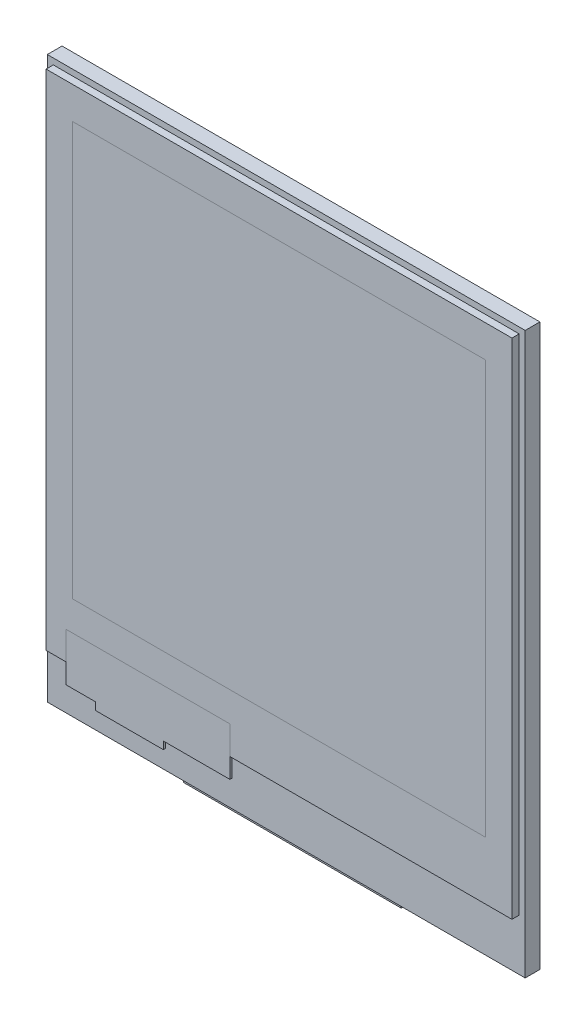
ISO-10303-21;
HEADER;
FILE_DESCRIPTION(('STEP AP214'),'2;1');
FILE_NAME('part.step','',(''),(''),'','','');
FILE_SCHEMA(('AUTOMOTIVE_DESIGN { 1 0 10303 214 1 1 1 1 }'));
ENDSEC;
DATA;
#1=APPLICATION_CONTEXT('core data for automotive mechanical design processes');
#2=APPLICATION_PROTOCOL_DEFINITION('international standard','automotive_design',2000,#1);
#3=PRODUCT_CONTEXT('',#1,'mechanical');
#4=PRODUCT('Part','Part','',(#3));
#5=PRODUCT_RELATED_PRODUCT_CATEGORY('part','',(#4));
#6=PRODUCT_DEFINITION_FORMATION('','',#4);
#7=PRODUCT_DEFINITION_CONTEXT('part definition',#1,'design');
#8=PRODUCT_DEFINITION('design','',#6,#7);
#9=PRODUCT_DEFINITION_SHAPE('','',#8);
#10=(LENGTH_UNIT() NAMED_UNIT(*) SI_UNIT(.MILLI.,.METRE.));
#11=(NAMED_UNIT(*) PLANE_ANGLE_UNIT() SI_UNIT($,.RADIAN.));
#12=(NAMED_UNIT(*) SI_UNIT($,.STERADIAN.) SOLID_ANGLE_UNIT());
#13=UNCERTAINTY_MEASURE_WITH_UNIT(LENGTH_MEASURE(1.E-05),#10,'distance_accuracy_value','');
#14=(GEOMETRIC_REPRESENTATION_CONTEXT(3) GLOBAL_UNCERTAINTY_ASSIGNED_CONTEXT((#13)) GLOBAL_UNIT_ASSIGNED_CONTEXT((#10,
#11,#12)) REPRESENTATION_CONTEXT('',''));
#15=CARTESIAN_POINT('',(0.,0.,0.));
#16=DIRECTION('',(0.,0.,1.));
#17=DIRECTION('',(1.,0.,0.));
#18=AXIS2_PLACEMENT_3D('',#15,#16,#17);
#19=CARTESIAN_POINT('',(0.,0.,1.46));
#20=DIRECTION('',(0.,0.,-1.));
#21=DIRECTION('',(-1.,0.,0.));
#22=AXIS2_PLACEMENT_3D('',#19,#20,#21);
#23=PLANE('',#22);
#24=CARTESIAN_POINT('',(-13.7549999999994,-11.3900000000022,1.46));
#25=CARTESIAN_POINT('',(-13.7549999999998,-11.062500000002,1.46));
#26=CARTESIAN_POINT('',(-13.7550000000005,-10.4075000000016,1.46));
#27=CARTESIAN_POINT('',(-13.7550000000015,-9.42500000000101,1.46));
#28=CARTESIAN_POINT('',(-13.7550000000024,-8.44250000000035,1.46));
#29=CARTESIAN_POINT('',(-13.7550000000029,-7.45999999999966,1.46));
#30=CARTESIAN_POINT('',(-13.7550000000033,-6.47749999999892,1.46));
#31=CARTESIAN_POINT('',(-13.7550000000035,-5.49499999999817,1.46));
#32=CARTESIAN_POINT('',(-13.7550000000034,-4.5124999999974,1.46));
#33=CARTESIAN_POINT('',(-13.7550000000032,-3.52999999999665,1.46));
#34=CARTESIAN_POINT('',(-13.7550000000027,-2.5474999999959,1.46));
#35=CARTESIAN_POINT('',(-13.755000000002,-1.56499999999521,1.46));
#36=CARTESIAN_POINT('',(-13.7550000000012,-0.582499999994542,1.46));
#37=CARTESIAN_POINT('',(-13.7550000000004,0.400000000006056,1.46));
#38=CARTESIAN_POINT('',(-13.7549999999993,1.38250000000663,1.46));
#39=CARTESIAN_POINT('',(-13.7549999999982,2.36500000000713,1.46));
#40=CARTESIAN_POINT('',(-13.7549999999973,3.3475000000076,1.46));
#41=CARTESIAN_POINT('',(-13.7549999999964,4.330000000008,1.46));
#42=CARTESIAN_POINT('',(-13.7549999999955,5.31250000000838,1.46));
#43=CARTESIAN_POINT('',(-13.7549999999946,6.29500000000871,1.46));
#44=CARTESIAN_POINT('',(-13.7549999999937,7.27750000000901,1.46));
#45=CARTESIAN_POINT('',(-13.7549999999929,8.26000000000927,1.46));
#46=CARTESIAN_POINT('',(-13.754999999992,9.24250000000949,1.46));
#47=CARTESIAN_POINT('',(-13.7549999999911,10.2250000000097,1.46));
#48=CARTESIAN_POINT('',(-13.7549999999902,11.2075000000099,1.46));
#49=CARTESIAN_POINT('',(-13.7549999999893,12.19000000001,1.46));
#50=CARTESIAN_POINT('',(-13.7549999999883,13.1725000000101,1.46));
#51=CARTESIAN_POINT('',(-13.7549999999873,14.1550000000102,1.46));
#52=CARTESIAN_POINT('',(-13.7549999999863,15.1375000000103,1.46));
#53=CARTESIAN_POINT('',(-13.7549999999856,15.7925000000103,1.46));
#54=CARTESIAN_POINT('',(-13.7549999999852,16.1200000000104,1.46));
#55=B_SPLINE_CURVE_WITH_KNOTS('',3,(#24,#25,#26,#27,#28,#29,#30,#31,#32,#33,#34,#35,#36,#37,#38,
#39,#40,#41,#42,#43,#44,#45,#46,#47,#48,#49,#50,#51,#52,#53,#54),.UNSPECIFIED.,.F.,.F.,(4,1,1,1,
1,1,1,1,1,1,1,1,1,1,1,1,1,1,1,1,1,1,1,1,1,1,1,1,4),(0.,0.0357142857142883,0.0714285714285811,
0.107142857142873,0.142857142857169,0.178571428571464,0.214285714285763,0.250000000000059,
0.285714285714357,0.321428571428653,0.357142857142949,0.392857142857241,0.428571428571534,
0.464285714285823,0.500000000000112,0.535714285714397,0.571428571428682,0.607142857142965,
0.642857142857247,0.678571428571526,0.714285714285806,0.750000000000083,0.78571428571436,
0.821428571428635,0.857142857142909,0.892857142857183,0.928571428571456,0.964285714285729,1.),.UNSPECIFIED.);
#56=CARTESIAN_POINT('',(-13.7549999999994,-11.3900000000022,1.46));
#57=VERTEX_POINT('',#56);
#58=CARTESIAN_POINT('',(-13.7549999999852,16.1200000000104,1.46));
#59=VERTEX_POINT('',#58);
#60=EDGE_CURVE('E865',#57,#59,#55,.T.);
#61=ORIENTED_EDGE('',*,*,#60,.T.);
#62=CARTESIAN_POINT('',(-13.7549999999852,16.1200000000104,1.46));
#63=CARTESIAN_POINT('',(-13.4274999999853,16.1200000000099,1.46));
#64=CARTESIAN_POINT('',(-12.7724999999854,16.1200000000091,1.46));
#65=CARTESIAN_POINT('',(-11.7899999999857,16.120000000008,1.46));
#66=CARTESIAN_POINT('',(-10.807499999986,16.1200000000069,1.46));
#67=CARTESIAN_POINT('',(-9.8249999999864,16.1200000000059,1.46));
#68=CARTESIAN_POINT('',(-8.84249999998682,16.1200000000049,1.46));
#69=CARTESIAN_POINT('',(-7.85999999998727,16.1200000000041,1.46));
#70=CARTESIAN_POINT('',(-6.87749999998775,16.1200000000032,1.46));
#71=CARTESIAN_POINT('',(-5.89499999998824,16.1200000000026,1.46));
#72=CARTESIAN_POINT('',(-4.91249999998874,16.1200000000019,1.46));
#73=CARTESIAN_POINT('',(-3.92999999998925,16.1200000000014,1.46));
#74=CARTESIAN_POINT('',(-2.94749999998975,16.1200000000009,1.46));
#75=CARTESIAN_POINT('',(-1.96499999999025,16.1200000000005,1.46));
#76=CARTESIAN_POINT('',(-0.982499999990737,16.1200000000001,1.46));
#77=CARTESIAN_POINT('',(8.7901976060676E-12,16.1199999999999,1.46));
#78=CARTESIAN_POINT('',(0.982500000008335,16.1199999999996,1.46));
#79=CARTESIAN_POINT('',(1.9650000000079,16.1199999999994,1.46));
#80=CARTESIAN_POINT('',(2.9475000000075,16.1199999999992,1.46));
#81=CARTESIAN_POINT('',(3.93000000000712,16.1199999999992,1.46));
#82=CARTESIAN_POINT('',(4.91250000000677,16.1199999999991,1.46));
#83=CARTESIAN_POINT('',(5.89500000000646,16.1199999999991,1.46));
#84=CARTESIAN_POINT('',(6.87750000000618,16.119999999999,1.46));
#85=CARTESIAN_POINT('',(7.86000000000593,16.119999999999,1.46));
#86=CARTESIAN_POINT('',(8.84250000000573,16.1199999999991,1.46));
#87=CARTESIAN_POINT('',(9.82500000000555,16.1199999999991,1.46));
#88=CARTESIAN_POINT('',(10.8075000000054,16.1199999999991,1.46));
#89=CARTESIAN_POINT('',(11.7900000000053,16.119999999999,1.46));
#90=CARTESIAN_POINT('',(12.7725000000053,16.119999999999,1.46));
#91=CARTESIAN_POINT('',(13.4275000000052,16.119999999999,1.46));
#92=CARTESIAN_POINT('',(13.7550000000052,16.1199999999989,1.46));
#93=B_SPLINE_CURVE_WITH_KNOTS('',3,(#62,#63,#64,#65,#66,#67,#68,#69,#70,#71,#72,#73,#74,#75,#76,
#77,#78,#79,#80,#81,#82,#83,#84,#85,#86,#87,#88,#89,#90,#91,#92),.UNSPECIFIED.,.F.,.F.,(4,1,1,1,
1,1,1,1,1,1,1,1,1,1,1,1,1,1,1,1,1,1,1,1,1,1,1,1,4),(0.,0.0357142857142905,0.0714285714285789,
0.107142857142865,0.14285714285715,0.178571428571432,0.214285714285714,0.249999999999995,
0.285714285714275,0.321428571428555,0.357142857142834,0.392857142857114,0.428571428571394,
0.464285714285675,0.499999999999956,0.535714285714237,0.57142857142852,0.607142857142803,
0.642857142857087,0.678571428571373,0.714285714285659,0.749999999999947,0.785714285714237,
0.821428571428527,0.857142857142819,0.892857142857112,0.928571428571407,0.964285714285703,1.),.UNSPECIFIED.);
#94=CARTESIAN_POINT('',(13.7550000000052,16.1199999999989,1.46));
#95=VERTEX_POINT('',#94);
#96=EDGE_CURVE('E886',#59,#95,#93,.T.);
#97=ORIENTED_EDGE('',*,*,#96,.T.);
#98=CARTESIAN_POINT('',(13.7550000000052,16.1199999999989,1.46));
#99=CARTESIAN_POINT('',(13.7550000000051,15.792499999999,1.46));
#100=CARTESIAN_POINT('',(13.755000000005,15.137499999999,1.46));
#101=CARTESIAN_POINT('',(13.7550000000046,14.1549999999991,1.46));
#102=CARTESIAN_POINT('',(13.7550000000043,13.1724999999993,1.46));
#103=CARTESIAN_POINT('',(13.7550000000041,12.1899999999995,1.46));
#104=CARTESIAN_POINT('',(13.7550000000037,11.2074999999997,1.46));
#105=CARTESIAN_POINT('',(13.7550000000034,10.2249999999999,1.46));
#106=CARTESIAN_POINT('',(13.7550000000031,9.24250000000016,1.46));
#107=CARTESIAN_POINT('',(13.7550000000028,8.26000000000045,1.46));
#108=CARTESIAN_POINT('',(13.7550000000026,7.27750000000077,1.46));
#109=CARTESIAN_POINT('',(13.7550000000023,6.2950000000011,1.46));
#110=CARTESIAN_POINT('',(13.7550000000021,5.31250000000146,1.46));
#111=CARTESIAN_POINT('',(13.7550000000019,4.33000000000183,1.46));
#112=CARTESIAN_POINT('',(13.7550000000019,3.34750000000221,1.46));
#113=CARTESIAN_POINT('',(13.7550000000018,2.36500000000261,1.46));
#114=CARTESIAN_POINT('',(13.7550000000018,1.38250000000302,1.46));
#115=CARTESIAN_POINT('',(13.7550000000018,0.400000000003429,1.46));
#116=CARTESIAN_POINT('',(13.755000000002,-0.582499999996155,1.46));
#117=CARTESIAN_POINT('',(13.7550000000021,-1.56499999999575,1.46));
#118=CARTESIAN_POINT('',(13.7550000000024,-2.54749999999534,1.46));
#119=CARTESIAN_POINT('',(13.7550000000026,-3.52999999999494,1.46));
#120=CARTESIAN_POINT('',(13.755000000003,-4.51249999999455,1.46));
#121=CARTESIAN_POINT('',(13.7550000000034,-5.49499999999419,1.46));
#122=CARTESIAN_POINT('',(13.7550000000038,-6.47749999999384,1.46));
#123=CARTESIAN_POINT('',(13.7550000000044,-7.45999999999352,1.46));
#124=CARTESIAN_POINT('',(13.7550000000049,-8.44249999999321,1.46));
#125=CARTESIAN_POINT('',(13.7550000000056,-9.42499999999295,1.46));
#126=CARTESIAN_POINT('',(13.7550000000063,-10.4074999999927,1.46));
#127=CARTESIAN_POINT('',(13.7550000000068,-11.0624999999926,1.46));
#128=CARTESIAN_POINT('',(13.7550000000071,-11.3899999999925,1.46));
#129=B_SPLINE_CURVE_WITH_KNOTS('',3,(#98,#99,#100,#101,#102,#103,#104,#105,#106,#107,#108,#109,
#110,#111,#112,#113,#114,#115,#116,#117,#118,#119,#120,#121,#122,#123,#124,#125,#126,#127,#128),
.UNSPECIFIED.,.F.,.F.,(4,1,1,1,1,1,1,1,1,1,1,1,1,1,1,1,1,1,1,1,1,1,1,1,1,1,1,1,4),(0.,
0.0357142857142941,0.0714285714285869,0.107142857142878,0.142857142857169,0.178571428571458,
0.214285714285746,0.250000000000034,0.28571428571432,0.321428571428605,0.35714285714289,
0.392857142857174,0.428571428571457,0.46428571428574,0.500000000000022,0.535714285714304,
0.571428571428586,0.607142857142868,0.64285714285715,0.678571428571432,0.714285714285714,
0.749999999999997,0.78571428571428,0.821428571428564,0.857142857142849,0.892857142857135,
0.928571428571422,0.96428571428571,1.),.UNSPECIFIED.);
#130=CARTESIAN_POINT('',(13.7550000000071,-11.3899999999925,1.46));
#131=VERTEX_POINT('',#130);
#132=EDGE_CURVE('E877',#95,#131,#129,.T.);
#133=ORIENTED_EDGE('',*,*,#132,.T.);
#134=CARTESIAN_POINT('',(13.7550000000071,-11.3899999999925,1.46));
#135=CARTESIAN_POINT('',(13.427500000007,-11.3899999999927,1.46));
#136=CARTESIAN_POINT('',(12.7725000000069,-11.3899999999932,1.46));
#137=CARTESIAN_POINT('',(11.7900000000067,-11.389999999994,1.46));
#138=CARTESIAN_POINT('',(10.8075000000064,-11.3899999999946,1.46));
#139=CARTESIAN_POINT('',(9.82500000000615,-11.3899999999952,1.46));
#140=CARTESIAN_POINT('',(8.84250000000587,-11.3899999999957,1.46));
#141=CARTESIAN_POINT('',(7.86000000000558,-11.3899999999962,1.46));
#142=CARTESIAN_POINT('',(6.87750000000527,-11.3899999999966,1.46));
#143=CARTESIAN_POINT('',(5.89500000000495,-11.389999999997,1.46));
#144=CARTESIAN_POINT('',(4.91250000000463,-11.3899999999974,1.46));
#145=CARTESIAN_POINT('',(3.9300000000043,-11.3899999999977,1.46));
#146=CARTESIAN_POINT('',(2.94750000000397,-11.389999999998,1.46));
#147=CARTESIAN_POINT('',(1.96500000000362,-11.3899999999983,1.46));
#148=CARTESIAN_POINT('',(0.98250000000327,-11.3899999999985,1.46));
#149=CARTESIAN_POINT('',(2.91192345070968E-12,-11.3899999999987,1.46));
#150=CARTESIAN_POINT('',(-0.982499999997449,-11.3899999999989,1.46));
#151=CARTESIAN_POINT('',(-1.9649999999978,-11.389999999999,1.46));
#152=CARTESIAN_POINT('',(-2.94749999999815,-11.3899999999992,1.46));
#153=CARTESIAN_POINT('',(-3.92999999999849,-11.3899999999994,1.46));
#154=CARTESIAN_POINT('',(-4.91249999999879,-11.3899999999996,1.46));
#155=CARTESIAN_POINT('',(-5.89499999999907,-11.3899999999997,1.46));
#156=CARTESIAN_POINT('',(-6.87749999999932,-11.3899999999999,1.46));
#157=CARTESIAN_POINT('',(-7.85999999999952,-11.3900000000001,1.46));
#158=CARTESIAN_POINT('',(-8.84249999999968,-11.3900000000003,1.46));
#159=CARTESIAN_POINT('',(-9.82499999999977,-11.3900000000005,1.46));
#160=CARTESIAN_POINT('',(-10.8074999999998,-11.3900000000008,1.46));
#161=CARTESIAN_POINT('',(-11.7899999999998,-11.3900000000012,1.46));
#162=CARTESIAN_POINT('',(-12.7724999999996,-11.3900000000016,1.46));
#163=CARTESIAN_POINT('',(-13.4274999999995,-11.390000000002,1.46));
#164=CARTESIAN_POINT('',(-13.7549999999994,-11.3900000000022,1.46));
#165=B_SPLINE_CURVE_WITH_KNOTS('',3,(#134,#135,#136,#137,#138,#139,#140,#141,#142,#143,#144,
#145,#146,#147,#148,#149,#150,#151,#152,#153,#154,#155,#156,#157,#158,#159,#160,#161,#162,#163,
#164),.UNSPECIFIED.,.F.,.F.,(4,1,1,1,1,1,1,1,1,1,1,1,1,1,1,1,1,1,1,1,1,1,1,1,1,1,1,1,4),(0.,
0.0357142857142853,0.0714285714285704,0.107142857142857,0.142857142857143,0.178571428571431,
0.214285714285719,0.250000000000007,0.285714285714296,0.321428571428585,0.357142857142874,
0.392857142857163,0.428571428571453,0.464285714285743,0.500000000000033,0.535714285714324,
0.571428571428614,0.607142857142904,0.642857142857193,0.678571428571482,0.714285714285769,
0.750000000000056,0.785714285714341,0.821428571428624,0.857142857142905,0.892857142857183,
0.928571428571458,0.964285714285731,1.),.UNSPECIFIED.);
#166=EDGE_CURVE('E868',#131,#57,#165,.T.);
#167=ORIENTED_EDGE('',*,*,#166,.T.);
#168=EDGE_LOOP('',(#61,#97,#133,#167));
#169=FACE_BOUND('',#168,.T.);
#170=DIRECTION('',(1.,0.,0.));
#171=VECTOR('',#170,1.);
#172=CARTESIAN_POINT('',(0.,-15.24,1.46));
#173=LINE('',#172,#171);
#174=CARTESIAN_POINT('',(-15.5000000000001,-15.24,1.46));
#175=VERTEX_POINT('',#174);
#176=CARTESIAN_POINT('',(-14.1700000000001,-15.24,1.46));
#177=VERTEX_POINT('',#176);
#178=EDGE_CURVE('E803',#175,#177,#173,.T.);
#179=ORIENTED_EDGE('',*,*,#178,.T.);
#180=CARTESIAN_POINT('',(-14.1700000000001,-15.2400000000001,1.46));
#181=CARTESIAN_POINT('',(-14.1700000000001,-14.9266666666667,1.46));
#182=CARTESIAN_POINT('',(-14.1700000000001,-14.3,1.46));
#183=CARTESIAN_POINT('',(-14.1700000000001,-13.6733333333334,1.46));
#184=CARTESIAN_POINT('',(-14.1700000000001,-13.36,1.46));
#185=B_SPLINE_CURVE_WITH_KNOTS('',3,(#180,#181,#182,#183,#184),.UNSPECIFIED.,.F.,.F.,(4,1,4),
(0.,0.500000000000021,1.),.UNSPECIFIED.);
#186=CARTESIAN_POINT('',(-14.1700000000001,-13.36,1.46));
#187=VERTEX_POINT('',#186);
#188=EDGE_CURVE('E13',#177,#187,#185,.T.);
#189=ORIENTED_EDGE('',*,*,#188,.T.);
#190=CARTESIAN_POINT('',(-14.1700000000001,-13.36,1.46));
#191=CARTESIAN_POINT('',(-13.839696969697,-13.36,1.46));
#192=CARTESIAN_POINT('',(-13.179090909091,-13.36,1.46));
#193=CARTESIAN_POINT('',(-12.1881818181819,-13.36,1.46));
#194=CARTESIAN_POINT('',(-11.1972727272728,-13.36,1.46));
#195=CARTESIAN_POINT('',(-10.2063636363637,-13.36,1.46));
#196=CARTESIAN_POINT('',(-9.21545454545462,-13.3600000000001,1.46));
#197=CARTESIAN_POINT('',(-8.22454545454552,-13.3600000000001,1.46));
#198=CARTESIAN_POINT('',(-7.23363636363643,-13.3600000000001,1.46));
#199=CARTESIAN_POINT('',(-6.24272727272734,-13.3600000000001,1.46));
#200=CARTESIAN_POINT('',(-5.25181818181825,-13.3600000000001,1.46));
#201=CARTESIAN_POINT('',(-4.26090909090915,-13.3600000000001,1.46));
#202=CARTESIAN_POINT('',(-3.60030303030309,-13.3600000000001,1.46));
#203=CARTESIAN_POINT('',(-3.27000000000006,-13.3600000000001,1.46));
#204=B_SPLINE_CURVE_WITH_KNOTS('',3,(#190,#191,#192,#193,#194,#195,#196,#197,#198,#199,#200,
#201,#202,#203),.UNSPECIFIED.,.F.,.F.,(4,1,1,1,1,1,1,1,1,1,1,4),(0.,0.0909090909090909,
0.181818181818182,0.272727272727272,0.363636363636363,0.454545454545454,0.545454545454545,
0.636363636363636,0.727272727272727,0.818181818181818,0.909090909090909,1.),.UNSPECIFIED.);
#205=CARTESIAN_POINT('',(-3.27000000000006,-13.3600000000001,1.46));
#206=VERTEX_POINT('',#205);
#207=EDGE_CURVE('E536',#187,#206,#204,.T.);
#208=ORIENTED_EDGE('',*,*,#207,.T.);
#209=CARTESIAN_POINT('',(-3.27000000000006,-13.3600000000001,1.46));
#210=CARTESIAN_POINT('',(-3.27000000000007,-13.6733333333335,1.46));
#211=CARTESIAN_POINT('',(-3.27000000000008,-14.3000000000001,1.46));
#212=CARTESIAN_POINT('',(-3.27000000000008,-14.9266666666667,1.46));
#213=CARTESIAN_POINT('',(-3.27000000000008,-15.24,1.46));
#214=B_SPLINE_CURVE_WITH_KNOTS('',3,(#209,#210,#211,#212,#213),.UNSPECIFIED.,.F.,.F.,(4,1,4),
(0.,0.500000000000014,1.),.UNSPECIFIED.);
#215=CARTESIAN_POINT('',(-3.27000000000008,-15.24,1.46));
#216=VERTEX_POINT('',#215);
#217=EDGE_CURVE('E894',#206,#216,#214,.T.);
#218=ORIENTED_EDGE('',*,*,#217,.T.);
#219=CARTESIAN_POINT('',(15.4999999999999,-15.24,1.46));
#220=VERTEX_POINT('',#219);
#221=EDGE_CURVE('E786',#216,#220,#173,.T.);
#222=ORIENTED_EDGE('',*,*,#221,.T.);
#223=DIRECTION('',(0.,-1.,0.));
#224=VECTOR('',#223,1.);
#225=CARTESIAN_POINT('',(15.4999999999999,0.,1.46));
#226=LINE('',#225,#224);
#227=CARTESIAN_POINT('',(15.4999999999999,18.26,1.46));
#228=VERTEX_POINT('',#227);
#229=EDGE_CURVE('E805',#228,#220,#226,.T.);
#230=ORIENTED_EDGE('',*,*,#229,.F.);
#231=DIRECTION('',(1.,0.,0.));
#232=VECTOR('',#231,1.);
#233=CARTESIAN_POINT('',(0.,18.26,1.46));
#234=LINE('',#233,#232);
#235=CARTESIAN_POINT('',(-15.5000000000001,18.26,1.46));
#236=VERTEX_POINT('',#235);
#237=EDGE_CURVE('E808',#236,#228,#234,.T.);
#238=ORIENTED_EDGE('',*,*,#237,.F.);
#239=DIRECTION('',(0.,-1.,0.));
#240=VECTOR('',#239,1.);
#241=CARTESIAN_POINT('',(-15.5000000000001,0.,1.46));
#242=LINE('',#241,#240);
#243=EDGE_CURVE('E811',#236,#175,#242,.T.);
#244=ORIENTED_EDGE('',*,*,#243,.T.);
#245=EDGE_LOOP('',(#179,#189,#208,#218,#222,#230,#238,#244));
#246=FACE_BOUND('',#245,.T.);
#247=ADVANCED_FACE('F525',(#169,#246),#23,.F.);
#248=ORIENTED_EDGE('',*,*,#188,.F.);
#249=DIRECTION('',(0.,-1.,0.));
#250=VECTOR('',#249,1.);
#251=CARTESIAN_POINT('',(-14.1700000000001,-15.24,1.46));
#252=LINE('',#251,#250);
#253=CARTESIAN_POINT('',(-14.1700000000001,-16.5600000000001,1.46));
#254=VERTEX_POINT('',#253);
#255=EDGE_CURVE('E723',#177,#254,#252,.T.);
#256=ORIENTED_EDGE('',*,*,#255,.T.);
#257=DIRECTION('',(1.,0.,0.));
#258=VECTOR('',#257,1.);
#259=CARTESIAN_POINT('',(-14.1700000000001,-16.5600000000001,1.46));
#260=LINE('',#259,#258);
#261=CARTESIAN_POINT('',(-12.2,-16.5600000000001,1.46));
#262=VERTEX_POINT('',#261);
#263=EDGE_CURVE('E756',#254,#262,#260,.T.);
#264=ORIENTED_EDGE('',*,*,#263,.T.);
#265=DIRECTION('',(0.,-1.,0.));
#266=VECTOR('',#265,1.);
#267=CARTESIAN_POINT('',(-12.2,-16.5600000000001,1.46));
#268=LINE('',#267,#266);
#269=CARTESIAN_POINT('',(-12.2,-17.0600000000001,1.46));
#270=VERTEX_POINT('',#269);
#271=EDGE_CURVE('E759',#262,#270,#268,.T.);
#272=ORIENTED_EDGE('',*,*,#271,.T.);
#273=DIRECTION('',(1.,0.,0.));
#274=VECTOR('',#273,1.);
#275=CARTESIAN_POINT('',(-12.2,-17.0600000000001,1.46));
#276=LINE('',#275,#274);
#277=CARTESIAN_POINT('',(-9.95000000000003,-17.0600000000001,1.46));
#278=VERTEX_POINT('',#277);
#279=EDGE_CURVE('E771',#270,#278,#276,.T.);
#280=ORIENTED_EDGE('',*,*,#279,.T.);
#281=CARTESIAN_POINT('',(-7.70000000000003,-17.0600000000001,1.46));
#282=VERTEX_POINT('',#281);
#283=EDGE_CURVE('E762',#278,#282,#276,.T.);
#284=ORIENTED_EDGE('',*,*,#283,.T.);
#285=DIRECTION('',(0.,1.,0.));
#286=VECTOR('',#285,1.);
#287=CARTESIAN_POINT('',(-7.70000000000003,-17.0600000000001,1.46));
#288=LINE('',#287,#286);
#289=CARTESIAN_POINT('',(-7.70000000000003,-16.5600000000001,1.46));
#290=VERTEX_POINT('',#289);
#291=EDGE_CURVE('E765',#282,#290,#288,.T.);
#292=ORIENTED_EDGE('',*,*,#291,.T.);
#293=DIRECTION('',(1.,0.,0.));
#294=VECTOR('',#293,1.);
#295=CARTESIAN_POINT('',(-7.70000000000003,-16.5600000000001,1.46));
#296=LINE('',#295,#294);
#297=CARTESIAN_POINT('',(-5.48500000000005,-16.5600000000001,1.46));
#298=VERTEX_POINT('',#297);
#299=EDGE_CURVE('E776',#290,#298,#296,.T.);
#300=ORIENTED_EDGE('',*,*,#299,.T.);
#301=CARTESIAN_POINT('',(-3.27000000000008,-16.5600000000001,1.46));
#302=VERTEX_POINT('',#301);
#303=EDGE_CURVE('E774',#298,#302,#296,.T.);
#304=ORIENTED_EDGE('',*,*,#303,.T.);
#305=DIRECTION('',(0.,1.,0.));
#306=VECTOR('',#305,1.);
#307=CARTESIAN_POINT('',(-3.27000000000008,-16.5600000000001,1.46));
#308=LINE('',#307,#306);
#309=EDGE_CURVE('E732',#302,#216,#308,.T.);
#310=ORIENTED_EDGE('',*,*,#309,.T.);
#311=ORIENTED_EDGE('',*,*,#217,.F.);
#312=ORIENTED_EDGE('',*,*,#207,.F.);
#313=EDGE_LOOP('',(#248,#256,#264,#272,#280,#284,#292,#300,#304,#310,#311,#312));
#314=FACE_BOUND('',#313,.T.);
#315=ADVANCED_FACE('F923',(#314),#23,.F.);
#316=CARTESIAN_POINT('',(0.,0.,0.98));
#317=DIRECTION('',(0.,0.,1.));
#318=DIRECTION('',(1.,0.,0.));
#319=AXIS2_PLACEMENT_3D('',#316,#317,#318);
#320=PLANE('',#319);
#321=DIRECTION('',(0.,1.,0.));
#322=VECTOR('',#321,1.);
#323=CARTESIAN_POINT('',(15.9,18.66,0.98));
#324=LINE('',#323,#322);
#325=CARTESIAN_POINT('',(15.9,-18.6600000000001,0.98));
#326=VERTEX_POINT('',#325);
#327=CARTESIAN_POINT('',(15.9,18.66,0.98));
#328=VERTEX_POINT('',#327);
#329=EDGE_CURVE('E836',#326,#328,#324,.T.);
#330=ORIENTED_EDGE('',*,*,#329,.T.);
#331=DIRECTION('',(-1.,0.,0.));
#332=VECTOR('',#331,1.);
#333=CARTESIAN_POINT('',(-15.9,18.66,0.98));
#334=LINE('',#333,#332);
#335=CARTESIAN_POINT('',(-15.9,18.66,0.98));
#336=VERTEX_POINT('',#335);
#337=EDGE_CURVE('E839',#328,#336,#334,.T.);
#338=ORIENTED_EDGE('',*,*,#337,.T.);
#339=DIRECTION('',(0.,-1.,0.));
#340=VECTOR('',#339,1.);
#341=CARTESIAN_POINT('',(-15.9,18.66,0.98));
#342=LINE('',#341,#340);
#343=CARTESIAN_POINT('',(-15.9,-18.6600000000001,0.98));
#344=VERTEX_POINT('',#343);
#345=EDGE_CURVE('E842',#336,#344,#342,.T.);
#346=ORIENTED_EDGE('',*,*,#345,.T.);
#347=DIRECTION('',(1.,0.,0.));
#348=VECTOR('',#347,1.);
#349=CARTESIAN_POINT('',(-15.9,-18.6600000000001,0.98));
#350=LINE('',#349,#348);
#351=EDGE_CURVE('E844',#344,#326,#350,.T.);
#352=ORIENTED_EDGE('',*,*,#351,.T.);
#353=EDGE_LOOP('',(#330,#338,#346,#352));
#354=FACE_BOUND('',#353,.T.);
#355=DIRECTION('',(0.,1.,0.));
#356=VECTOR('',#355,1.);
#357=CARTESIAN_POINT('',(15.4999999999999,0.,0.98));
#358=LINE('',#357,#356);
#359=CARTESIAN_POINT('',(15.4999999999999,-15.24,0.98));
#360=VERTEX_POINT('',#359);
#361=CARTESIAN_POINT('',(15.4999999999999,18.26,0.98));
#362=VERTEX_POINT('',#361);
#363=EDGE_CURVE('E830',#360,#362,#358,.T.);
#364=ORIENTED_EDGE('',*,*,#363,.F.);
#365=DIRECTION('',(-1.,0.,0.));
#366=VECTOR('',#365,1.);
#367=CARTESIAN_POINT('',(0.,-15.24,0.98));
#368=LINE('',#367,#366);
#369=CARTESIAN_POINT('',(-15.5000000000001,-15.24,0.98));
#370=VERTEX_POINT('',#369);
#371=EDGE_CURVE('E832',#360,#370,#368,.T.);
#372=ORIENTED_EDGE('',*,*,#371,.T.);
#373=DIRECTION('',(0.,1.,0.));
#374=VECTOR('',#373,1.);
#375=CARTESIAN_POINT('',(-15.5000000000001,0.,0.98));
#376=LINE('',#375,#374);
#377=CARTESIAN_POINT('',(-15.5000000000001,18.26,0.98));
#378=VERTEX_POINT('',#377);
#379=EDGE_CURVE('E824',#370,#378,#376,.T.);
#380=ORIENTED_EDGE('',*,*,#379,.T.);
#381=DIRECTION('',(-1.,0.,0.));
#382=VECTOR('',#381,1.);
#383=CARTESIAN_POINT('',(0.,18.26,0.98));
#384=LINE('',#383,#382);
#385=EDGE_CURVE('E827',#362,#378,#384,.T.);
#386=ORIENTED_EDGE('',*,*,#385,.F.);
#387=EDGE_LOOP('',(#364,#372,#380,#386));
#388=FACE_BOUND('',#387,.T.);
#389=ADVANCED_FACE('F987',(#354,#388),#320,.T.);
#390=CARTESIAN_POINT('',(15.9,18.66,0.98));
#391=DIRECTION('',(-1.,0.,0.));
#392=DIRECTION('',(0.,0.,1.));
#393=AXIS2_PLACEMENT_3D('',#390,#391,#392);
#394=PLANE('',#393);
#395=DIRECTION('',(0.,1.,0.));
#396=VECTOR('',#395,1.);
#397=CARTESIAN_POINT('',(15.9,18.66,0.));
#398=LINE('',#397,#396);
#399=CARTESIAN_POINT('',(15.9,-18.6600000000001,0.));
#400=VERTEX_POINT('',#399);
#401=CARTESIAN_POINT('',(15.9,18.66,0.));
#402=VERTEX_POINT('',#401);
#403=EDGE_CURVE('E835',#400,#402,#398,.T.);
#404=ORIENTED_EDGE('',*,*,#403,.T.);
#405=DIRECTION('',(0.,0.,-1.));
#406=VECTOR('',#405,1.);
#407=CARTESIAN_POINT('',(15.9,18.66,0.98));
#408=LINE('',#407,#406);
#409=EDGE_CURVE('E862',#328,#402,#408,.T.);
#410=ORIENTED_EDGE('',*,*,#409,.F.);
#411=ORIENTED_EDGE('',*,*,#329,.F.);
#412=DIRECTION('',(0.,0.,-1.));
#413=VECTOR('',#412,1.);
#414=CARTESIAN_POINT('',(15.9,-18.6600000000001,0.98));
#415=LINE('',#414,#413);
#416=EDGE_CURVE('E846',#326,#400,#415,.T.);
#417=ORIENTED_EDGE('',*,*,#416,.T.);
#418=EDGE_LOOP('',(#404,#410,#411,#417));
#419=FACE_BOUND('',#418,.T.);
#420=ADVANCED_FACE('F527',(#419),#394,.F.);
#421=CARTESIAN_POINT('',(-15.9,18.66,0.98));
#422=DIRECTION('',(0.,-1.,0.));
#423=DIRECTION('',(0.,0.,-1.));
#424=AXIS2_PLACEMENT_3D('',#421,#422,#423);
#425=PLANE('',#424);
#426=DIRECTION('',(-1.,0.,0.));
#427=VECTOR('',#426,1.);
#428=CARTESIAN_POINT('',(-15.9,18.66,0.));
#429=LINE('',#428,#427);
#430=CARTESIAN_POINT('',(-15.9,18.66,0.));
#431=VERTEX_POINT('',#430);
#432=EDGE_CURVE('E849',#402,#431,#429,.T.);
#433=ORIENTED_EDGE('',*,*,#432,.T.);
#434=DIRECTION('',(0.,0.,-1.));
#435=VECTOR('',#434,1.);
#436=CARTESIAN_POINT('',(-15.9,18.66,0.98));
#437=LINE('',#436,#435);
#438=EDGE_CURVE('E859',#336,#431,#437,.T.);
#439=ORIENTED_EDGE('',*,*,#438,.F.);
#440=ORIENTED_EDGE('',*,*,#337,.F.);
#441=ORIENTED_EDGE('',*,*,#409,.T.);
#442=EDGE_LOOP('',(#433,#439,#440,#441));
#443=FACE_BOUND('',#442,.T.);
#444=ADVANCED_FACE('F1019',(#443),#425,.F.);
#445=CARTESIAN_POINT('',(-15.9,18.66,0.98));
#446=DIRECTION('',(1.,0.,0.));
#447=DIRECTION('',(0.,1.,0.));
#448=AXIS2_PLACEMENT_3D('',#445,#446,#447);
#449=PLANE('',#448);
#450=DIRECTION('',(0.,-1.,0.));
#451=VECTOR('',#450,1.);
#452=CARTESIAN_POINT('',(-15.9,18.66,0.));
#453=LINE('',#452,#451);
#454=CARTESIAN_POINT('',(-15.9,-18.6600000000001,0.));
#455=VERTEX_POINT('',#454);
#456=EDGE_CURVE('E851',#431,#455,#453,.T.);
#457=ORIENTED_EDGE('',*,*,#456,.T.);
#458=DIRECTION('',(0.,0.,-1.));
#459=VECTOR('',#458,1.);
#460=CARTESIAN_POINT('',(-15.9,-18.6600000000001,0.98));
#461=LINE('',#460,#459);
#462=EDGE_CURVE('E856',#344,#455,#461,.T.);
#463=ORIENTED_EDGE('',*,*,#462,.F.);
#464=ORIENTED_EDGE('',*,*,#345,.F.);
#465=ORIENTED_EDGE('',*,*,#438,.T.);
#466=EDGE_LOOP('',(#457,#463,#464,#465));
#467=FACE_BOUND('',#466,.T.);
#468=ADVANCED_FACE('F1016',(#467),#449,.F.);
#469=CARTESIAN_POINT('',(-15.9,-18.6600000000001,0.98));
#470=DIRECTION('',(0.,1.,0.));
#471=DIRECTION('',(0.,0.,1.));
#472=AXIS2_PLACEMENT_3D('',#469,#470,#471);
#473=PLANE('',#472);
#474=DIRECTION('',(0.,0.,1.));
#475=VECTOR('',#474,1.);
#476=CARTESIAN_POINT('',(-7.25,-18.6600000000001,0.43));
#477=LINE('',#476,#475);
#478=CARTESIAN_POINT('',(-7.25,-18.6600000000001,0.43));
#479=VERTEX_POINT('',#478);
#480=CARTESIAN_POINT('',(-7.25,-18.6600000000001,0.58));
#481=VERTEX_POINT('',#480);
#482=EDGE_CURVE('E724',#479,#481,#477,.T.);
#483=ORIENTED_EDGE('',*,*,#482,.T.);
#484=DIRECTION('',(1.,0.,0.));
#485=VECTOR('',#484,1.);
#486=CARTESIAN_POINT('',(-7.25,-18.6600000000001,0.58));
#487=LINE('',#486,#485);
#488=CARTESIAN_POINT('',(7.25,-18.6600000000001,0.58));
#489=VERTEX_POINT('',#488);
#490=EDGE_CURVE('E712',#481,#489,#487,.T.);
#491=ORIENTED_EDGE('',*,*,#490,.T.);
#492=DIRECTION('',(0.,0.,1.));
#493=VECTOR('',#492,1.);
#494=CARTESIAN_POINT('',(7.25,-18.6600000000001,0.43));
#495=LINE('',#494,#493);
#496=CARTESIAN_POINT('',(7.25,-18.6600000000001,0.43));
#497=VERTEX_POINT('',#496);
#498=EDGE_CURVE('E704',#497,#489,#495,.T.);
#499=ORIENTED_EDGE('',*,*,#498,.F.);
#500=DIRECTION('',(1.,0.,0.));
#501=VECTOR('',#500,1.);
#502=CARTESIAN_POINT('',(-7.25,-18.6600000000001,0.43));
#503=LINE('',#502,#501);
#504=EDGE_CURVE('E692',#479,#497,#503,.T.);
#505=ORIENTED_EDGE('',*,*,#504,.F.);
#506=EDGE_LOOP('',(#483,#491,#499,#505));
#507=FACE_BOUND('',#506,.T.);
#508=DIRECTION('',(1.,0.,0.));
#509=VECTOR('',#508,1.);
#510=CARTESIAN_POINT('',(-15.9,-18.6600000000001,0.));
#511=LINE('',#510,#509);
#512=EDGE_CURVE('E840',#455,#400,#511,.T.);
#513=ORIENTED_EDGE('',*,*,#512,.T.);
#514=ORIENTED_EDGE('',*,*,#416,.F.);
#515=ORIENTED_EDGE('',*,*,#351,.F.);
#516=ORIENTED_EDGE('',*,*,#462,.T.);
#517=EDGE_LOOP('',(#513,#514,#515,#516));
#518=FACE_BOUND('',#517,.T.);
#519=ADVANCED_FACE('F1012',(#507,#518),#473,.F.);
#520=CARTESIAN_POINT('',(0.,0.,0.));
#521=DIRECTION('',(0.,0.,1.));
#522=DIRECTION('',(1.,0.,0.));
#523=AXIS2_PLACEMENT_3D('',#520,#521,#522);
#524=PLANE('',#523);
#525=ORIENTED_EDGE('',*,*,#403,.F.);
#526=ORIENTED_EDGE('',*,*,#512,.F.);
#527=ORIENTED_EDGE('',*,*,#456,.F.);
#528=ORIENTED_EDGE('',*,*,#432,.F.);
#529=EDGE_LOOP('',(#525,#526,#527,#528));
#530=FACE_BOUND('',#529,.T.);
#531=ADVANCED_FACE('F1006',(#530),#524,.F.);
#532=CARTESIAN_POINT('',(0.,-15.24,1.46));
#533=DIRECTION('',(0.,1.,0.));
#534=DIRECTION('',(-1.,0.,0.));
#535=AXIS2_PLACEMENT_3D('',#532,#533,#534);
#536=PLANE('',#535);
#537=ORIENTED_EDGE('',*,*,#221,.F.);
#538=DIRECTION('',(0.,0.,1.));
#539=VECTOR('',#538,1.);
#540=CARTESIAN_POINT('',(-3.27000000000008,-15.24,1.31));
#541=LINE('',#540,#539);
#542=CARTESIAN_POINT('',(-3.27000000000008,-15.24,1.31));
#543=VERTEX_POINT('',#542);
#544=EDGE_CURVE('E783',#543,#216,#541,.T.);
#545=ORIENTED_EDGE('',*,*,#544,.F.);
#546=DIRECTION('',(-1.,0.,0.));
#547=VECTOR('',#546,1.);
#548=CARTESIAN_POINT('',(-14.1700000000001,-15.24,1.31));
#549=LINE('',#548,#547);
#550=CARTESIAN_POINT('',(-14.1700000000001,-15.24,1.31));
#551=VERTEX_POINT('',#550);
#552=EDGE_CURVE('E728',#543,#551,#549,.T.);
#553=ORIENTED_EDGE('',*,*,#552,.T.);
#554=DIRECTION('',(0.,0.,1.));
#555=VECTOR('',#554,1.);
#556=CARTESIAN_POINT('',(-14.1700000000001,-15.24,1.31));
#557=LINE('',#556,#555);
#558=EDGE_CURVE('E753',#551,#177,#557,.T.);
#559=ORIENTED_EDGE('',*,*,#558,.T.);
#560=ORIENTED_EDGE('',*,*,#178,.F.);
#561=DIRECTION('',(0.,0.,-1.));
#562=VECTOR('',#561,1.);
#563=CARTESIAN_POINT('',(-15.5000000000001,-15.24,1.46));
#564=LINE('',#563,#562);
#565=EDGE_CURVE('E813',#175,#370,#564,.T.);
#566=ORIENTED_EDGE('',*,*,#565,.T.);
#567=ORIENTED_EDGE('',*,*,#371,.F.);
#568=DIRECTION('',(0.,0.,-1.));
#569=VECTOR('',#568,1.);
#570=CARTESIAN_POINT('',(15.4999999999999,-15.24,1.46));
#571=LINE('',#570,#569);
#572=EDGE_CURVE('E821',#220,#360,#571,.T.);
#573=ORIENTED_EDGE('',*,*,#572,.F.);
#574=EDGE_LOOP('',(#537,#545,#553,#559,#560,#566,#567,#573));
#575=FACE_BOUND('',#574,.T.);
#576=ADVANCED_FACE('F930',(#575),#536,.F.);
#577=CARTESIAN_POINT('',(15.4999999999999,0.,1.46));
#578=DIRECTION('',(1.,0.,0.));
#579=DIRECTION('',(0.,1.,0.));
#580=AXIS2_PLACEMENT_3D('',#577,#578,#579);
#581=PLANE('',#580);
#582=ORIENTED_EDGE('',*,*,#572,.T.);
#583=ORIENTED_EDGE('',*,*,#363,.T.);
#584=DIRECTION('',(0.,0.,-1.));
#585=VECTOR('',#584,1.);
#586=CARTESIAN_POINT('',(15.4999999999999,18.26,1.46));
#587=LINE('',#586,#585);
#588=EDGE_CURVE('E818',#228,#362,#587,.T.);
#589=ORIENTED_EDGE('',*,*,#588,.F.);
#590=ORIENTED_EDGE('',*,*,#229,.T.);
#591=EDGE_LOOP('',(#582,#583,#589,#590));
#592=FACE_BOUND('',#591,.T.);
#593=ADVANCED_FACE('F933',(#592),#581,.T.);
#594=CARTESIAN_POINT('',(0.,18.26,1.46));
#595=DIRECTION('',(0.,1.,0.));
#596=DIRECTION('',(0.,0.,1.));
#597=AXIS2_PLACEMENT_3D('',#594,#595,#596);
#598=PLANE('',#597);
#599=ORIENTED_EDGE('',*,*,#588,.T.);
#600=ORIENTED_EDGE('',*,*,#385,.T.);
#601=DIRECTION('',(0.,0.,-1.));
#602=VECTOR('',#601,1.);
#603=CARTESIAN_POINT('',(-15.5000000000001,18.26,1.46));
#604=LINE('',#603,#602);
#605=EDGE_CURVE('E816',#236,#378,#604,.T.);
#606=ORIENTED_EDGE('',*,*,#605,.F.);
#607=ORIENTED_EDGE('',*,*,#237,.T.);
#608=EDGE_LOOP('',(#599,#600,#606,#607));
#609=FACE_BOUND('',#608,.T.);
#610=ADVANCED_FACE('F936',(#609),#598,.T.);
#611=CARTESIAN_POINT('',(-15.5000000000001,0.,1.46));
#612=DIRECTION('',(1.,0.,0.));
#613=DIRECTION('',(0.,1.,0.));
#614=AXIS2_PLACEMENT_3D('',#611,#612,#613);
#615=PLANE('',#614);
#616=ORIENTED_EDGE('',*,*,#379,.F.);
#617=ORIENTED_EDGE('',*,*,#565,.F.);
#618=ORIENTED_EDGE('',*,*,#243,.F.);
#619=ORIENTED_EDGE('',*,*,#605,.T.);
#620=EDGE_LOOP('',(#616,#617,#618,#619));
#621=FACE_BOUND('',#620,.T.);
#622=ADVANCED_FACE('F941',(#621),#615,.F.);
#623=ORIENTED_EDGE('',*,*,#96,.F.);
#624=ORIENTED_EDGE('',*,*,#60,.F.);
#625=ORIENTED_EDGE('',*,*,#166,.F.);
#626=ORIENTED_EDGE('',*,*,#132,.F.);
#627=EDGE_LOOP('',(#623,#624,#625,#626));
#628=FACE_BOUND('',#627,.T.);
#629=ADVANCED_FACE('F979',(#628),#23,.F.);
#630=CARTESIAN_POINT('',(-3.27000000000008,-16.5600000000001,1.31));
#631=DIRECTION('',(1.,0.,0.));
#632=DIRECTION('',(0.,0.,-1.));
#633=AXIS2_PLACEMENT_3D('',#630,#631,#632);
#634=PLANE('',#633);
#635=ORIENTED_EDGE('',*,*,#309,.F.);
#636=DIRECTION('',(0.,0.,1.));
#637=VECTOR('',#636,1.);
#638=CARTESIAN_POINT('',(-3.27000000000008,-16.5600000000001,1.31));
#639=LINE('',#638,#637);
#640=CARTESIAN_POINT('',(-3.27000000000008,-16.5600000000001,1.31));
#641=VERTEX_POINT('',#640);
#642=EDGE_CURVE('E787',#641,#302,#639,.T.);
#643=ORIENTED_EDGE('',*,*,#642,.F.);
#644=DIRECTION('',(0.,1.,0.));
#645=VECTOR('',#644,1.);
#646=CARTESIAN_POINT('',(-3.27000000000008,-16.5600000000001,1.31));
#647=LINE('',#646,#645);
#648=EDGE_CURVE('E750',#641,#543,#647,.T.);
#649=ORIENTED_EDGE('',*,*,#648,.T.);
#650=ORIENTED_EDGE('',*,*,#544,.T.);
#651=EDGE_LOOP('',(#635,#643,#649,#650));
#652=FACE_BOUND('',#651,.T.);
#653=ADVANCED_FACE('F927',(#652),#634,.T.);
#654=CARTESIAN_POINT('',(-7.70000000000003,-16.5600000000001,1.31));
#655=DIRECTION('',(0.,-1.,0.));
#656=DIRECTION('',(0.,0.,-1.));
#657=AXIS2_PLACEMENT_3D('',#654,#655,#656);
#658=PLANE('',#657);
#659=ORIENTED_EDGE('',*,*,#299,.F.);
#660=DIRECTION('',(0.,0.,1.));
#661=VECTOR('',#660,1.);
#662=CARTESIAN_POINT('',(-7.70000000000003,-16.5600000000001,1.31));
#663=LINE('',#662,#661);
#664=CARTESIAN_POINT('',(-7.70000000000003,-16.5600000000001,1.31));
#665=VERTEX_POINT('',#664);
#666=EDGE_CURVE('E790',#665,#290,#663,.T.);
#667=ORIENTED_EDGE('',*,*,#666,.F.);
#668=DIRECTION('',(1.,0.,0.));
#669=VECTOR('',#668,1.);
#670=CARTESIAN_POINT('',(-7.70000000000003,-16.5600000000001,1.31));
#671=LINE('',#670,#669);
#672=EDGE_CURVE('E747',#665,#641,#671,.T.);
#673=ORIENTED_EDGE('',*,*,#672,.T.);
#674=ORIENTED_EDGE('',*,*,#642,.T.);
#675=ORIENTED_EDGE('',*,*,#303,.F.);
#676=EDGE_LOOP('',(#659,#667,#673,#674,#675));
#677=FACE_BOUND('',#676,.T.);
#678=ADVANCED_FACE('F969',(#677),#658,.T.);
#679=CARTESIAN_POINT('',(-7.70000000000003,-17.0600000000001,1.31));
#680=DIRECTION('',(1.,0.,0.));
#681=DIRECTION('',(0.,0.,-1.));
#682=AXIS2_PLACEMENT_3D('',#679,#680,#681);
#683=PLANE('',#682);
#684=ORIENTED_EDGE('',*,*,#291,.F.);
#685=DIRECTION('',(0.,0.,1.));
#686=VECTOR('',#685,1.);
#687=CARTESIAN_POINT('',(-7.70000000000003,-17.0600000000001,1.31));
#688=LINE('',#687,#686);
#689=CARTESIAN_POINT('',(-7.70000000000003,-17.0600000000001,1.31));
#690=VERTEX_POINT('',#689);
#691=EDGE_CURVE('E792',#690,#282,#688,.T.);
#692=ORIENTED_EDGE('',*,*,#691,.F.);
#693=DIRECTION('',(0.,1.,0.));
#694=VECTOR('',#693,1.);
#695=CARTESIAN_POINT('',(-7.70000000000003,-17.0600000000001,1.31));
#696=LINE('',#695,#694);
#697=EDGE_CURVE('E744',#690,#665,#696,.T.);
#698=ORIENTED_EDGE('',*,*,#697,.T.);
#699=ORIENTED_EDGE('',*,*,#666,.T.);
#700=EDGE_LOOP('',(#684,#692,#698,#699));
#701=FACE_BOUND('',#700,.T.);
#702=ADVANCED_FACE('F965',(#701),#683,.T.);
#703=CARTESIAN_POINT('',(-12.2,-17.0600000000001,1.31));
#704=DIRECTION('',(0.,-1.,0.));
#705=DIRECTION('',(0.,0.,-1.));
#706=AXIS2_PLACEMENT_3D('',#703,#704,#705);
#707=PLANE('',#706);
#708=ORIENTED_EDGE('',*,*,#279,.F.);
#709=DIRECTION('',(0.,0.,1.));
#710=VECTOR('',#709,1.);
#711=CARTESIAN_POINT('',(-12.2,-17.0600000000001,1.31));
#712=LINE('',#711,#710);
#713=CARTESIAN_POINT('',(-12.2,-17.0600000000001,1.31));
#714=VERTEX_POINT('',#713);
#715=EDGE_CURVE('E795',#714,#270,#712,.T.);
#716=ORIENTED_EDGE('',*,*,#715,.F.);
#717=DIRECTION('',(1.,0.,0.));
#718=VECTOR('',#717,1.);
#719=CARTESIAN_POINT('',(-12.2,-17.0600000000001,1.31));
#720=LINE('',#719,#718);
#721=EDGE_CURVE('E741',#714,#690,#720,.T.);
#722=ORIENTED_EDGE('',*,*,#721,.T.);
#723=ORIENTED_EDGE('',*,*,#691,.T.);
#724=ORIENTED_EDGE('',*,*,#283,.F.);
#725=EDGE_LOOP('',(#708,#716,#722,#723,#724));
#726=FACE_BOUND('',#725,.T.);
#727=ADVANCED_FACE('F960',(#726),#707,.T.);
#728=CARTESIAN_POINT('',(-12.2,-16.5600000000001,1.31));
#729=DIRECTION('',(-1.,0.,0.));
#730=DIRECTION('',(0.,0.,1.));
#731=AXIS2_PLACEMENT_3D('',#728,#729,#730);
#732=PLANE('',#731);
#733=ORIENTED_EDGE('',*,*,#271,.F.);
#734=DIRECTION('',(0.,0.,1.));
#735=VECTOR('',#734,1.);
#736=CARTESIAN_POINT('',(-12.2,-16.5600000000001,1.31));
#737=LINE('',#736,#735);
#738=CARTESIAN_POINT('',(-12.2,-16.5600000000001,1.31));
#739=VERTEX_POINT('',#738);
#740=EDGE_CURVE('E797',#739,#262,#737,.T.);
#741=ORIENTED_EDGE('',*,*,#740,.F.);
#742=DIRECTION('',(0.,-1.,0.));
#743=VECTOR('',#742,1.);
#744=CARTESIAN_POINT('',(-12.2,-16.5600000000001,1.31));
#745=LINE('',#744,#743);
#746=EDGE_CURVE('E738',#739,#714,#745,.T.);
#747=ORIENTED_EDGE('',*,*,#746,.T.);
#748=ORIENTED_EDGE('',*,*,#715,.T.);
#749=EDGE_LOOP('',(#733,#741,#747,#748));
#750=FACE_BOUND('',#749,.T.);
#751=ADVANCED_FACE('F958',(#750),#732,.T.);
#752=CARTESIAN_POINT('',(-14.1700000000001,-16.5600000000001,1.31));
#753=DIRECTION('',(0.,-1.,0.));
#754=DIRECTION('',(0.,0.,-1.));
#755=AXIS2_PLACEMENT_3D('',#752,#753,#754);
#756=PLANE('',#755);
#757=ORIENTED_EDGE('',*,*,#263,.F.);
#758=DIRECTION('',(0.,0.,1.));
#759=VECTOR('',#758,1.);
#760=CARTESIAN_POINT('',(-14.1700000000001,-16.5600000000001,1.31));
#761=LINE('',#760,#759);
#762=CARTESIAN_POINT('',(-14.1700000000001,-16.5600000000001,1.31));
#763=VERTEX_POINT('',#762);
#764=EDGE_CURVE('E799',#763,#254,#761,.T.);
#765=ORIENTED_EDGE('',*,*,#764,.F.);
#766=DIRECTION('',(1.,0.,0.));
#767=VECTOR('',#766,1.);
#768=CARTESIAN_POINT('',(-14.1700000000001,-16.5600000000001,1.31));
#769=LINE('',#768,#767);
#770=EDGE_CURVE('E735',#763,#739,#769,.T.);
#771=ORIENTED_EDGE('',*,*,#770,.T.);
#772=ORIENTED_EDGE('',*,*,#740,.T.);
#773=EDGE_LOOP('',(#757,#765,#771,#772));
#774=FACE_BOUND('',#773,.T.);
#775=ADVANCED_FACE('F954',(#774),#756,.T.);
#776=CARTESIAN_POINT('',(-14.1700000000001,-15.24,1.31));
#777=DIRECTION('',(-1.,0.,0.));
#778=DIRECTION('',(0.,-1.,0.));
#779=AXIS2_PLACEMENT_3D('',#776,#777,#778);
#780=PLANE('',#779);
#781=ORIENTED_EDGE('',*,*,#255,.F.);
#782=ORIENTED_EDGE('',*,*,#558,.F.);
#783=DIRECTION('',(0.,-1.,0.));
#784=VECTOR('',#783,1.);
#785=CARTESIAN_POINT('',(-14.1700000000001,-15.24,1.31));
#786=LINE('',#785,#784);
#787=EDGE_CURVE('E731',#551,#763,#786,.T.);
#788=ORIENTED_EDGE('',*,*,#787,.T.);
#789=ORIENTED_EDGE('',*,*,#764,.T.);
#790=EDGE_LOOP('',(#781,#782,#788,#789));
#791=FACE_BOUND('',#790,.T.);
#792=ADVANCED_FACE('F946',(#791),#780,.T.);
#793=CARTESIAN_POINT('',(0.,0.,1.31));
#794=DIRECTION('',(0.,0.,1.));
#795=DIRECTION('',(1.,0.,0.));
#796=AXIS2_PLACEMENT_3D('',#793,#794,#795);
#797=PLANE('',#796);
#798=ORIENTED_EDGE('',*,*,#552,.F.);
#799=ORIENTED_EDGE('',*,*,#648,.F.);
#800=ORIENTED_EDGE('',*,*,#672,.F.);
#801=ORIENTED_EDGE('',*,*,#697,.F.);
#802=ORIENTED_EDGE('',*,*,#721,.F.);
#803=ORIENTED_EDGE('',*,*,#746,.F.);
#804=ORIENTED_EDGE('',*,*,#770,.F.);
#805=ORIENTED_EDGE('',*,*,#787,.F.);
#806=EDGE_LOOP('',(#798,#799,#800,#801,#802,#803,#804,#805));
#807=FACE_BOUND('',#806,.T.);
#808=ADVANCED_FACE('F949',(#807),#797,.F.);
#809=CARTESIAN_POINT('',(-7.25,-19.1600000000001,0.43));
#810=DIRECTION('',(0.,-1.,0.));
#811=DIRECTION('',(0.,0.,-1.));
#812=AXIS2_PLACEMENT_3D('',#809,#810,#811);
#813=PLANE('',#812);
#814=DIRECTION('',(1.,0.,0.));
#815=VECTOR('',#814,1.);
#816=CARTESIAN_POINT('',(-7.25,-19.1600000000001,0.58));
#817=LINE('',#816,#815);
#818=CARTESIAN_POINT('',(-7.25,-19.1600000000001,0.58));
#819=VERTEX_POINT('',#818);
#820=CARTESIAN_POINT('',(7.25,-19.1600000000001,0.58));
#821=VERTEX_POINT('',#820);
#822=EDGE_CURVE('E717',#819,#821,#817,.T.);
#823=ORIENTED_EDGE('',*,*,#822,.F.);
#824=DIRECTION('',(0.,0.,1.));
#825=VECTOR('',#824,1.);
#826=CARTESIAN_POINT('',(-7.25,-19.1600000000001,0.43));
#827=LINE('',#826,#825);
#828=CARTESIAN_POINT('',(-7.25,-19.1600000000001,0.43));
#829=VERTEX_POINT('',#828);
#830=EDGE_CURVE('E708',#829,#819,#827,.T.);
#831=ORIENTED_EDGE('',*,*,#830,.F.);
#832=DIRECTION('',(1.,0.,0.));
#833=VECTOR('',#832,1.);
#834=CARTESIAN_POINT('',(-7.25,-19.1600000000001,0.43));
#835=LINE('',#834,#833);
#836=CARTESIAN_POINT('',(7.25,-19.1600000000001,0.43));
#837=VERTEX_POINT('',#836);
#838=EDGE_CURVE('E689',#829,#837,#835,.T.);
#839=ORIENTED_EDGE('',*,*,#838,.T.);
#840=DIRECTION('',(0.,0.,1.));
#841=VECTOR('',#840,1.);
#842=CARTESIAN_POINT('',(7.25,-19.1600000000001,0.43));
#843=LINE('',#842,#841);
#844=EDGE_CURVE('E697',#837,#821,#843,.T.);
#845=ORIENTED_EDGE('',*,*,#844,.T.);
#846=EDGE_LOOP('',(#823,#831,#839,#845));
#847=FACE_BOUND('',#846,.T.);
#848=ADVANCED_FACE('F707',(#847),#813,.T.);
#849=CARTESIAN_POINT('',(-7.25,-18.6600000000001,0.43));
#850=DIRECTION('',(-1.,0.,0.));
#851=DIRECTION('',(0.,-1.,0.));
#852=AXIS2_PLACEMENT_3D('',#849,#850,#851);
#853=PLANE('',#852);
#854=DIRECTION('',(0.,-1.,0.));
#855=VECTOR('',#854,1.);
#856=CARTESIAN_POINT('',(-7.25,-18.6600000000001,0.58));
#857=LINE('',#856,#855);
#858=EDGE_CURVE('E709',#481,#819,#857,.T.);
#859=ORIENTED_EDGE('',*,*,#858,.F.);
#860=ORIENTED_EDGE('',*,*,#482,.F.);
#861=DIRECTION('',(0.,-1.,0.));
#862=VECTOR('',#861,1.);
#863=CARTESIAN_POINT('',(-7.25,-18.6600000000001,0.43));
#864=LINE('',#863,#862);
#865=EDGE_CURVE('E705',#479,#829,#864,.T.);
#866=ORIENTED_EDGE('',*,*,#865,.T.);
#867=ORIENTED_EDGE('',*,*,#830,.T.);
#868=EDGE_LOOP('',(#859,#860,#866,#867));
#869=FACE_BOUND('',#868,.T.);
#870=ADVANCED_FACE('F1126',(#869),#853,.T.);
#871=CARTESIAN_POINT('',(7.25,-18.6600000000001,0.43));
#872=DIRECTION('',(-1.,0.,0.));
#873=DIRECTION('',(0.,-1.,0.));
#874=AXIS2_PLACEMENT_3D('',#871,#872,#873);
#875=PLANE('',#874);
#876=DIRECTION('',(0.,-1.,0.));
#877=VECTOR('',#876,1.);
#878=CARTESIAN_POINT('',(7.25,-18.6600000000001,0.58));
#879=LINE('',#878,#877);
#880=EDGE_CURVE('E700',#489,#821,#879,.T.);
#881=ORIENTED_EDGE('',*,*,#880,.T.);
#882=ORIENTED_EDGE('',*,*,#844,.F.);
#883=DIRECTION('',(0.,-1.,0.));
#884=VECTOR('',#883,1.);
#885=CARTESIAN_POINT('',(7.25,-18.6600000000001,0.43));
#886=LINE('',#885,#884);
#887=EDGE_CURVE('E684',#497,#837,#886,.T.);
#888=ORIENTED_EDGE('',*,*,#887,.F.);
#889=ORIENTED_EDGE('',*,*,#498,.T.);
#890=EDGE_LOOP('',(#881,#882,#888,#889));
#891=FACE_BOUND('',#890,.T.);
#892=ADVANCED_FACE('F698',(#891),#875,.F.);
#893=CARTESIAN_POINT('',(0.,0.,0.43));
#894=DIRECTION('',(0.,0.,-1.));
#895=DIRECTION('',(-1.,0.,0.));
#896=AXIS2_PLACEMENT_3D('',#893,#894,#895);
#897=PLANE('',#896);
#898=ORIENTED_EDGE('',*,*,#838,.F.);
#899=ORIENTED_EDGE('',*,*,#865,.F.);
#900=ORIENTED_EDGE('',*,*,#504,.T.);
#901=ORIENTED_EDGE('',*,*,#887,.T.);
#902=EDGE_LOOP('',(#898,#899,#900,#901));
#903=FACE_BOUND('',#902,.T.);
#904=ADVANCED_FACE('F686',(#903),#897,.T.);
#905=CARTESIAN_POINT('',(0.,0.,0.58));
#906=DIRECTION('',(0.,0.,-1.));
#907=DIRECTION('',(-1.,0.,0.));
#908=AXIS2_PLACEMENT_3D('',#905,#906,#907);
#909=PLANE('',#908);
#910=ORIENTED_EDGE('',*,*,#822,.T.);
#911=ORIENTED_EDGE('',*,*,#880,.F.);
#912=ORIENTED_EDGE('',*,*,#490,.F.);
#913=ORIENTED_EDGE('',*,*,#858,.T.);
#914=EDGE_LOOP('',(#910,#911,#912,#913));
#915=FACE_BOUND('',#914,.T.);
#916=ADVANCED_FACE('F1152',(#915),#909,.F.);
#917=CLOSED_SHELL('',(#247,#315,#389,#420,#444,#468,#519,#531,#576,#593,#610,#622,#629,#653,
#678,#702,#727,#751,#775,#792,#808,#848,#870,#892,#904,#916));
#918=MANIFOLD_SOLID_BREP('B2',#917);
#919=ADVANCED_BREP_SHAPE_REPRESENTATION('',(#18,#918),#14);
#920=SHAPE_DEFINITION_REPRESENTATION(#9,#919);
ENDSEC;
END-ISO-10303-21;
